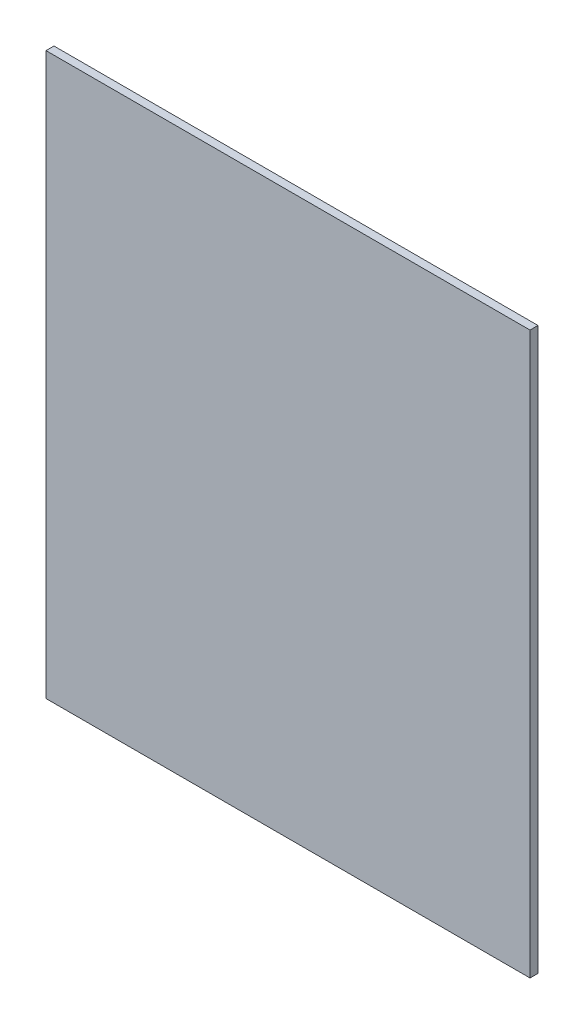
ISO-10303-21;
HEADER;
FILE_DESCRIPTION(('STEP AP214'),'2;1');
FILE_NAME('part.step','',(''),(''),'','','');
FILE_SCHEMA(('AUTOMOTIVE_DESIGN { 1 0 10303 214 1 1 1 1 }'));
ENDSEC;
DATA;
#1=APPLICATION_CONTEXT('core data for automotive mechanical design processes');
#2=APPLICATION_PROTOCOL_DEFINITION('international standard','automotive_design',2000,#1);
#3=PRODUCT_CONTEXT('',#1,'mechanical');
#4=PRODUCT('Part','Part','',(#3));
#5=PRODUCT_RELATED_PRODUCT_CATEGORY('part','',(#4));
#6=PRODUCT_DEFINITION_FORMATION('','',#4);
#7=PRODUCT_DEFINITION_CONTEXT('part definition',#1,'design');
#8=PRODUCT_DEFINITION('design','',#6,#7);
#9=PRODUCT_DEFINITION_SHAPE('','',#8);
#10=(LENGTH_UNIT() NAMED_UNIT(*) SI_UNIT(.MILLI.,.METRE.));
#11=(NAMED_UNIT(*) PLANE_ANGLE_UNIT() SI_UNIT($,.RADIAN.));
#12=(NAMED_UNIT(*) SI_UNIT($,.STERADIAN.) SOLID_ANGLE_UNIT());
#13=UNCERTAINTY_MEASURE_WITH_UNIT(LENGTH_MEASURE(1.E-05),#10,'distance_accuracy_value','');
#14=(GEOMETRIC_REPRESENTATION_CONTEXT(3) GLOBAL_UNCERTAINTY_ASSIGNED_CONTEXT((#13)) GLOBAL_UNIT_ASSIGNED_CONTEXT((#10,
#11,#12)) REPRESENTATION_CONTEXT('',''));
#15=CARTESIAN_POINT('',(0.,0.,0.));
#16=DIRECTION('',(0.,0.,1.));
#17=DIRECTION('',(1.,0.,0.));
#18=AXIS2_PLACEMENT_3D('',#15,#16,#17);
#19=CARTESIAN_POINT('',(0.,211.,3.));
#20=DIRECTION('',(1.,0.,0.));
#21=DIRECTION('',(0.,0.,-1.));
#22=AXIS2_PLACEMENT_3D('',#19,#20,#21);
#23=PLANE('',#22);
#24=DIRECTION('',(0.,-1.,0.));
#25=VECTOR('',#24,1.);
#26=CARTESIAN_POINT('',(0.,211.,0.));
#27=LINE('',#26,#25);
#28=CARTESIAN_POINT('',(0.,211.,0.));
#29=VERTEX_POINT('',#28);
#30=CARTESIAN_POINT('',(0.,0.,0.));
#31=VERTEX_POINT('',#30);
#32=EDGE_CURVE('E102',#29,#31,#27,.T.);
#33=ORIENTED_EDGE('',*,*,#32,.T.);
#34=DIRECTION('',(0.,0.,-1.));
#35=VECTOR('',#34,1.);
#36=CARTESIAN_POINT('',(0.,0.,3.));
#37=LINE('',#36,#35);
#38=CARTESIAN_POINT('',(0.,0.,3.));
#39=VERTEX_POINT('',#38);
#40=EDGE_CURVE('E11',#39,#31,#37,.T.);
#41=ORIENTED_EDGE('',*,*,#40,.F.);
#42=DIRECTION('',(0.,-1.,0.));
#43=VECTOR('',#42,1.);
#44=CARTESIAN_POINT('',(0.,211.,3.));
#45=LINE('',#44,#43);
#46=CARTESIAN_POINT('',(0.,211.,3.));
#47=VERTEX_POINT('',#46);
#48=EDGE_CURVE('E90',#47,#39,#45,.T.);
#49=ORIENTED_EDGE('',*,*,#48,.F.);
#50=DIRECTION('',(0.,0.,-1.));
#51=VECTOR('',#50,1.);
#52=CARTESIAN_POINT('',(0.,211.,3.));
#53=LINE('',#52,#51);
#54=EDGE_CURVE('E98',#47,#29,#53,.T.);
#55=ORIENTED_EDGE('',*,*,#54,.T.);
#56=EDGE_LOOP('',(#33,#41,#49,#55));
#57=FACE_BOUND('',#56,.T.);
#58=ADVANCED_FACE('F39',(#57),#23,.F.);
#59=CARTESIAN_POINT('',(0.,0.,3.));
#60=DIRECTION('',(0.,1.,0.));
#61=DIRECTION('',(0.,0.,1.));
#62=AXIS2_PLACEMENT_3D('',#59,#60,#61);
#63=PLANE('',#62);
#64=DIRECTION('',(1.,0.,0.));
#65=VECTOR('',#64,1.);
#66=CARTESIAN_POINT('',(0.,0.,0.));
#67=LINE('',#66,#65);
#68=CARTESIAN_POINT('',(182.,0.,0.));
#69=VERTEX_POINT('',#68);
#70=EDGE_CURVE('E94',#31,#69,#67,.T.);
#71=ORIENTED_EDGE('',*,*,#70,.T.);
#72=DIRECTION('',(0.,0.,-1.));
#73=VECTOR('',#72,1.);
#74=CARTESIAN_POINT('',(182.,0.,3.));
#75=LINE('',#74,#73);
#76=CARTESIAN_POINT('',(182.,0.,3.));
#77=VERTEX_POINT('',#76);
#78=EDGE_CURVE('E47',#77,#69,#75,.T.);
#79=ORIENTED_EDGE('',*,*,#78,.F.);
#80=DIRECTION('',(1.,0.,0.));
#81=VECTOR('',#80,1.);
#82=CARTESIAN_POINT('',(0.,0.,3.));
#83=LINE('',#82,#81);
#84=EDGE_CURVE('E85',#39,#77,#83,.T.);
#85=ORIENTED_EDGE('',*,*,#84,.F.);
#86=ORIENTED_EDGE('',*,*,#40,.T.);
#87=EDGE_LOOP('',(#71,#79,#85,#86));
#88=FACE_BOUND('',#87,.T.);
#89=ADVANCED_FACE('F93',(#88),#63,.F.);
#90=CARTESIAN_POINT('',(182.,0.,3.));
#91=DIRECTION('',(-1.,0.,0.));
#92=DIRECTION('',(0.,0.,1.));
#93=AXIS2_PLACEMENT_3D('',#90,#91,#92);
#94=PLANE('',#93);
#95=DIRECTION('',(0.,1.,0.));
#96=VECTOR('',#95,1.);
#97=CARTESIAN_POINT('',(182.,0.,0.));
#98=LINE('',#97,#96);
#99=CARTESIAN_POINT('',(182.,211.,0.));
#100=VERTEX_POINT('',#99);
#101=EDGE_CURVE('E72',#69,#100,#98,.T.);
#102=ORIENTED_EDGE('',*,*,#101,.T.);
#103=DIRECTION('',(0.,0.,-1.));
#104=VECTOR('',#103,1.);
#105=CARTESIAN_POINT('',(182.,211.,3.));
#106=LINE('',#105,#104);
#107=CARTESIAN_POINT('',(182.,211.,3.));
#108=VERTEX_POINT('',#107);
#109=EDGE_CURVE('E95',#108,#100,#106,.T.);
#110=ORIENTED_EDGE('',*,*,#109,.F.);
#111=DIRECTION('',(0.,1.,0.));
#112=VECTOR('',#111,1.);
#113=CARTESIAN_POINT('',(182.,0.,3.));
#114=LINE('',#113,#112);
#115=EDGE_CURVE('E88',#77,#108,#114,.T.);
#116=ORIENTED_EDGE('',*,*,#115,.F.);
#117=ORIENTED_EDGE('',*,*,#78,.T.);
#118=EDGE_LOOP('',(#102,#110,#116,#117));
#119=FACE_BOUND('',#118,.T.);
#120=ADVANCED_FACE('F96',(#119),#94,.F.);
#121=CARTESIAN_POINT('',(182.,211.,3.));
#122=DIRECTION('',(0.,-1.,0.));
#123=DIRECTION('',(0.,0.,-1.));
#124=AXIS2_PLACEMENT_3D('',#121,#122,#123);
#125=PLANE('',#124);
#126=DIRECTION('',(-1.,0.,0.));
#127=VECTOR('',#126,1.);
#128=CARTESIAN_POINT('',(182.,211.,0.));
#129=LINE('',#128,#127);
#130=EDGE_CURVE('E78',#100,#29,#129,.T.);
#131=ORIENTED_EDGE('',*,*,#130,.T.);
#132=ORIENTED_EDGE('',*,*,#54,.F.);
#133=DIRECTION('',(-1.,0.,0.));
#134=VECTOR('',#133,1.);
#135=CARTESIAN_POINT('',(182.,211.,3.));
#136=LINE('',#135,#134);
#137=EDGE_CURVE('E55',#108,#47,#136,.T.);
#138=ORIENTED_EDGE('',*,*,#137,.F.);
#139=ORIENTED_EDGE('',*,*,#109,.T.);
#140=EDGE_LOOP('',(#131,#132,#138,#139));
#141=FACE_BOUND('',#140,.T.);
#142=ADVANCED_FACE('F109',(#141),#125,.F.);
#143=CARTESIAN_POINT('',(0.,0.,3.));
#144=DIRECTION('',(0.,0.,1.));
#145=DIRECTION('',(1.,0.,0.));
#146=AXIS2_PLACEMENT_3D('',#143,#144,#145);
#147=PLANE('',#146);
#148=ORIENTED_EDGE('',*,*,#48,.T.);
#149=ORIENTED_EDGE('',*,*,#84,.T.);
#150=ORIENTED_EDGE('',*,*,#115,.T.);
#151=ORIENTED_EDGE('',*,*,#137,.T.);
#152=EDGE_LOOP('',(#148,#149,#150,#151));
#153=FACE_BOUND('',#152,.T.);
#154=ADVANCED_FACE('F86',(#153),#147,.T.);
#155=CARTESIAN_POINT('',(0.,0.,0.));
#156=DIRECTION('',(0.,0.,1.));
#157=DIRECTION('',(1.,0.,0.));
#158=AXIS2_PLACEMENT_3D('',#155,#156,#157);
#159=PLANE('',#158);
#160=ORIENTED_EDGE('',*,*,#32,.F.);
#161=ORIENTED_EDGE('',*,*,#130,.F.);
#162=ORIENTED_EDGE('',*,*,#101,.F.);
#163=ORIENTED_EDGE('',*,*,#70,.F.);
#164=EDGE_LOOP('',(#160,#161,#162,#163));
#165=FACE_BOUND('',#164,.T.);
#166=ADVANCED_FACE('F112',(#165),#159,.F.);
#167=CLOSED_SHELL('',(#58,#89,#120,#142,#154,#166));
#168=MANIFOLD_SOLID_BREP('B2',#167);
#169=ADVANCED_BREP_SHAPE_REPRESENTATION('',(#18,#168),#14);
#170=SHAPE_DEFINITION_REPRESENTATION(#9,#169);
ENDSEC;
END-ISO-10303-21;
